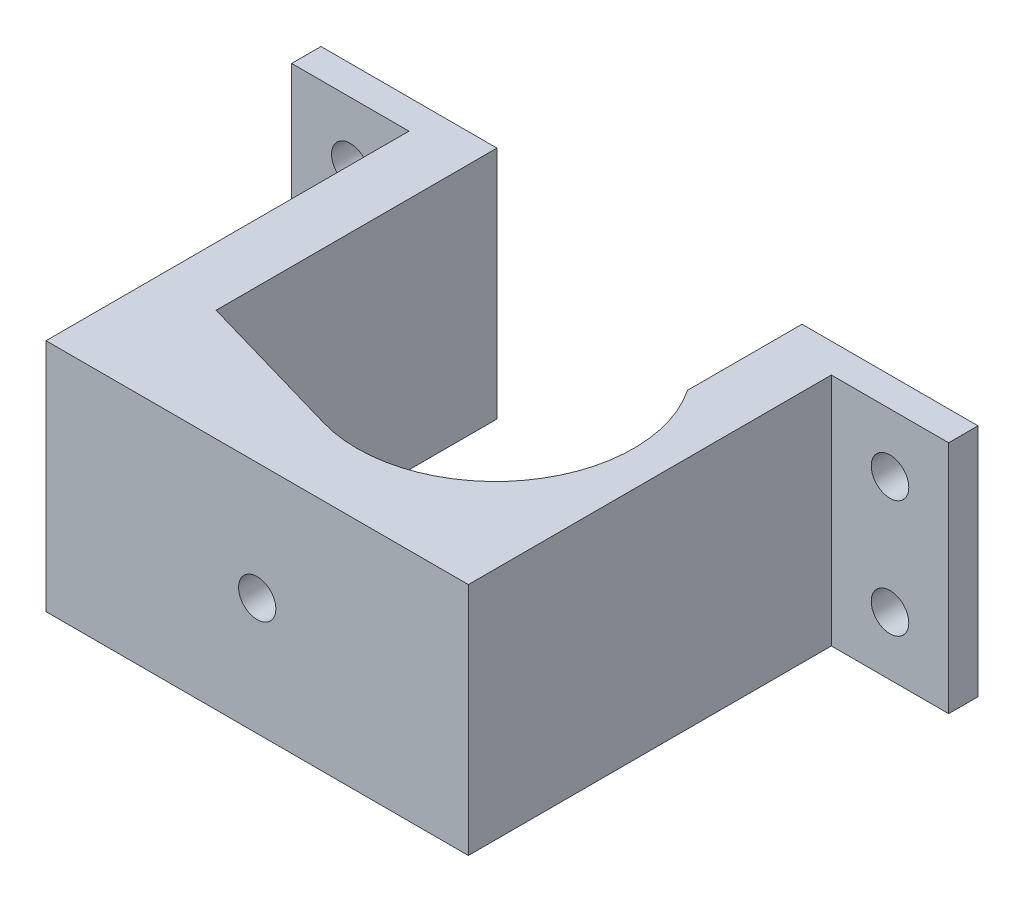
ISO-10303-21;
HEADER;
FILE_DESCRIPTION(('STEP AP214'),'2;1');
FILE_NAME('part.step','',(''),(''),'','','');
FILE_SCHEMA(('AUTOMOTIVE_DESIGN { 1 0 10303 214 1 1 1 1 }'));
ENDSEC;
DATA;
#1=APPLICATION_CONTEXT('core data for automotive mechanical design processes');
#2=APPLICATION_PROTOCOL_DEFINITION('international standard','automotive_design',2000,#1);
#3=PRODUCT_CONTEXT('',#1,'mechanical');
#4=PRODUCT('Part','Part','',(#3));
#5=PRODUCT_RELATED_PRODUCT_CATEGORY('part','',(#4));
#6=PRODUCT_DEFINITION_FORMATION('','',#4);
#7=PRODUCT_DEFINITION_CONTEXT('part definition',#1,'design');
#8=PRODUCT_DEFINITION('design','',#6,#7);
#9=PRODUCT_DEFINITION_SHAPE('','',#8);
#10=(LENGTH_UNIT() NAMED_UNIT(*) SI_UNIT(.MILLI.,.METRE.));
#11=(NAMED_UNIT(*) PLANE_ANGLE_UNIT() SI_UNIT($,.RADIAN.));
#12=(NAMED_UNIT(*) SI_UNIT($,.STERADIAN.) SOLID_ANGLE_UNIT());
#13=UNCERTAINTY_MEASURE_WITH_UNIT(LENGTH_MEASURE(1.E-05),#10,'distance_accuracy_value','');
#14=(GEOMETRIC_REPRESENTATION_CONTEXT(3) GLOBAL_UNCERTAINTY_ASSIGNED_CONTEXT((#13)) GLOBAL_UNIT_ASSIGNED_CONTEXT((#10,
#11,#12)) REPRESENTATION_CONTEXT('',''));
#15=CARTESIAN_POINT('',(0.,0.,0.));
#16=DIRECTION('',(0.,0.,1.));
#17=DIRECTION('',(1.,0.,0.));
#18=AXIS2_PLACEMENT_3D('',#15,#16,#17);
#19=CARTESIAN_POINT('',(18.796,25.4,21.7171296043708));
#20=DIRECTION('',(0.,0.,-1.));
#21=DIRECTION('',(-1.,0.,0.));
#22=AXIS2_PLACEMENT_3D('',#19,#20,#21);
#23=PLANE('',#22);
#24=DIRECTION('',(1.,0.,0.));
#25=VECTOR('',#24,1.);
#26=CARTESIAN_POINT('',(18.796,0.,21.7171296043708));
#27=LINE('',#26,#25);
#28=CARTESIAN_POINT('',(-26.924,0.,21.7171296043708));
#29=VERTEX_POINT('',#28);
#30=CARTESIAN_POINT('',(18.796,0.,21.7171296043708));
#31=VERTEX_POINT('',#30);
#32=EDGE_CURVE('E210',#29,#31,#27,.T.);
#33=ORIENTED_EDGE('',*,*,#32,.T.);
#34=DIRECTION('',(0.,-1.,0.));
#35=VECTOR('',#34,1.);
#36=CARTESIAN_POINT('',(18.796,25.4,21.7171296043708));
#37=LINE('',#36,#35);
#38=CARTESIAN_POINT('',(18.796,25.4,21.7171296043708));
#39=VERTEX_POINT('',#38);
#40=EDGE_CURVE('E254',#39,#31,#37,.T.);
#41=ORIENTED_EDGE('',*,*,#40,.F.);
#42=DIRECTION('',(1.,0.,0.));
#43=VECTOR('',#42,1.);
#44=CARTESIAN_POINT('',(18.796,25.4,21.7171296043708));
#45=LINE('',#44,#43);
#46=CARTESIAN_POINT('',(-26.924,25.4,21.7171296043708));
#47=VERTEX_POINT('',#46);
#48=EDGE_CURVE('E300',#47,#39,#45,.T.);
#49=ORIENTED_EDGE('',*,*,#48,.F.);
#50=DIRECTION('',(0.,-1.,0.));
#51=VECTOR('',#50,1.);
#52=CARTESIAN_POINT('',(-26.924,25.4,21.7171296043708));
#53=LINE('',#52,#51);
#54=EDGE_CURVE('E258',#47,#29,#53,.T.);
#55=ORIENTED_EDGE('',*,*,#54,.T.);
#56=EDGE_LOOP('',(#33,#41,#49,#55));
#57=FACE_BOUND('',#56,.T.);
#58=CARTESIAN_POINT('',(-4.06400000000001,12.7,21.7171296043708));
#59=DIRECTION('',(0.,0.,1.));
#60=DIRECTION('',(1.,0.,0.));
#61=AXIS2_PLACEMENT_3D('',#58,#59,#60);
#62=CIRCLE('',#61,2.01929999999999);
#63=CARTESIAN_POINT('',(-2.04470000000002,12.7,21.7171296043708));
#64=VERTEX_POINT('',#63);
#65=EDGE_CURVE('E331',#64,#64,#62,.T.);
#66=ORIENTED_EDGE('',*,*,#65,.F.);
#67=EDGE_LOOP('',(#66));
#68=FACE_BOUND('',#67,.T.);
#69=ADVANCED_FACE('F46',(#57,#68),#23,.F.);
#70=CARTESIAN_POINT('',(-20.574,25.4,-9.65199999999999));
#71=DIRECTION('',(-1.,0.,0.));
#72=DIRECTION('',(0.,0.,1.));
#73=AXIS2_PLACEMENT_3D('',#70,#71,#72);
#74=PLANE('',#73);
#75=DIRECTION('',(0.,0.,-1.));
#76=VECTOR('',#75,1.);
#77=CARTESIAN_POINT('',(-20.574,0.,-9.65199999999999));
#78=LINE('',#77,#76);
#79=CARTESIAN_POINT('',(-20.574,0.,9.65212960437079));
#80=VERTEX_POINT('',#79);
#81=CARTESIAN_POINT('',(-20.574,0.,-20.7467128871305));
#82=VERTEX_POINT('',#81);
#83=EDGE_CURVE('E123',#80,#82,#78,.T.);
#84=ORIENTED_EDGE('',*,*,#83,.T.);
#85=DIRECTION('',(0.,-1.,0.));
#86=VECTOR('',#85,1.);
#87=CARTESIAN_POINT('',(-20.574,25.4,-20.7467128871305));
#88=LINE('',#87,#86);
#89=CARTESIAN_POINT('',(-20.574,25.4,-20.7467128871305));
#90=VERTEX_POINT('',#89);
#91=EDGE_CURVE('E61',#90,#82,#88,.T.);
#92=ORIENTED_EDGE('',*,*,#91,.F.);
#93=DIRECTION('',(0.,0.,-1.));
#94=VECTOR('',#93,1.);
#95=CARTESIAN_POINT('',(-20.574,25.4,-9.65199999999999));
#96=LINE('',#95,#94);
#97=CARTESIAN_POINT('',(-20.574,25.4,9.65212960437079));
#98=VERTEX_POINT('',#97);
#99=EDGE_CURVE('E129',#98,#90,#96,.T.);
#100=ORIENTED_EDGE('',*,*,#99,.F.);
#101=DIRECTION('',(0.,-1.,0.));
#102=VECTOR('',#101,1.);
#103=CARTESIAN_POINT('',(-20.574,25.4,9.65212960437079));
#104=LINE('',#103,#102);
#105=EDGE_CURVE('E190',#98,#80,#104,.T.);
#106=ORIENTED_EDGE('',*,*,#105,.T.);
#107=EDGE_LOOP('',(#84,#92,#100,#106));
#108=FACE_BOUND('',#107,.T.);
#109=ADVANCED_FACE('F48',(#108),#74,.F.);
#110=CARTESIAN_POINT('',(-39.624,25.4,-20.7467128871305));
#111=DIRECTION('',(0.,0.,1.));
#112=DIRECTION('',(1.,0.,0.));
#113=AXIS2_PLACEMENT_3D('',#110,#111,#112);
#114=PLANE('',#113);
#115=CARTESIAN_POINT('',(-33.274,6.35,-20.7467128871305));
#116=DIRECTION('',(0.,0.,1.));
#117=DIRECTION('',(1.,0.,0.));
#118=AXIS2_PLACEMENT_3D('',#115,#116,#117);
#119=CIRCLE('',#118,2.032);
#120=CARTESIAN_POINT('',(-31.242,6.35,-20.7467128871305));
#121=VERTEX_POINT('',#120);
#122=EDGE_CURVE('E345',#121,#121,#119,.T.);
#123=ORIENTED_EDGE('',*,*,#122,.T.);
#124=EDGE_LOOP('',(#123));
#125=FACE_BOUND('',#124,.T.);
#126=CARTESIAN_POINT('',(-33.274,19.05,-20.7467128871305));
#127=DIRECTION('',(0.,0.,1.));
#128=DIRECTION('',(1.,0.,0.));
#129=AXIS2_PLACEMENT_3D('',#126,#127,#128);
#130=CIRCLE('',#129,2.03200000000002);
#131=CARTESIAN_POINT('',(-31.242,19.05,-20.7467128871305));
#132=VERTEX_POINT('',#131);
#133=EDGE_CURVE('E197',#132,#132,#130,.T.);
#134=ORIENTED_EDGE('',*,*,#133,.T.);
#135=EDGE_LOOP('',(#134));
#136=FACE_BOUND('',#135,.T.);
#137=DIRECTION('',(-1.,0.,0.));
#138=VECTOR('',#137,1.);
#139=CARTESIAN_POINT('',(-39.624,0.,-20.7467128871305));
#140=LINE('',#139,#138);
#141=CARTESIAN_POINT('',(-39.624,0.,-20.7467128871305));
#142=VERTEX_POINT('',#141);
#143=EDGE_CURVE('E196',#82,#142,#140,.T.);
#144=ORIENTED_EDGE('',*,*,#143,.T.);
#145=DIRECTION('',(0.,-1.,0.));
#146=VECTOR('',#145,1.);
#147=CARTESIAN_POINT('',(-39.624,25.4,-20.7467128871305));
#148=LINE('',#147,#146);
#149=CARTESIAN_POINT('',(-39.624,25.4,-20.7467128871305));
#150=VERTEX_POINT('',#149);
#151=EDGE_CURVE('E270',#150,#142,#148,.T.);
#152=ORIENTED_EDGE('',*,*,#151,.F.);
#153=DIRECTION('',(-1.,0.,0.));
#154=VECTOR('',#153,1.);
#155=CARTESIAN_POINT('',(-39.624,25.4,-20.7467128871305));
#156=LINE('',#155,#154);
#157=EDGE_CURVE('E279',#90,#150,#156,.T.);
#158=ORIENTED_EDGE('',*,*,#157,.F.);
#159=ORIENTED_EDGE('',*,*,#91,.T.);
#160=EDGE_LOOP('',(#144,#152,#158,#159));
#161=FACE_BOUND('',#160,.T.);
#162=ADVANCED_FACE('F277',(#125,#136,#161),#114,.F.);
#163=CARTESIAN_POINT('',(-39.624,25.4,-20.7467128871305));
#164=DIRECTION('',(1.,0.,0.));
#165=DIRECTION('',(0.,0.,-1.));
#166=AXIS2_PLACEMENT_3D('',#163,#164,#165);
#167=PLANE('',#166);
#168=DIRECTION('',(0.,0.,1.));
#169=VECTOR('',#168,1.);
#170=CARTESIAN_POINT('',(-39.624,0.,-20.7467128871305));
#171=LINE('',#170,#169);
#172=CARTESIAN_POINT('',(-39.624,0.,-17.5717128871305));
#173=VERTEX_POINT('',#172);
#174=EDGE_CURVE('E200',#142,#173,#171,.T.);
#175=ORIENTED_EDGE('',*,*,#174,.T.);
#176=DIRECTION('',(0.,-1.,0.));
#177=VECTOR('',#176,1.);
#178=CARTESIAN_POINT('',(-39.624,25.4,-17.5717128871305));
#179=LINE('',#178,#177);
#180=CARTESIAN_POINT('',(-39.624,25.4,-17.5717128871305));
#181=VERTEX_POINT('',#180);
#182=EDGE_CURVE('E266',#181,#173,#179,.T.);
#183=ORIENTED_EDGE('',*,*,#182,.F.);
#184=DIRECTION('',(0.,0.,1.));
#185=VECTOR('',#184,1.);
#186=CARTESIAN_POINT('',(-39.624,25.4,-20.7467128871305));
#187=LINE('',#186,#185);
#188=EDGE_CURVE('E296',#150,#181,#187,.T.);
#189=ORIENTED_EDGE('',*,*,#188,.F.);
#190=ORIENTED_EDGE('',*,*,#151,.T.);
#191=EDGE_LOOP('',(#175,#183,#189,#190));
#192=FACE_BOUND('',#191,.T.);
#193=ADVANCED_FACE('F286',(#192),#167,.F.);
#194=CARTESIAN_POINT('',(-39.624,25.4,-17.5717128871305));
#195=DIRECTION('',(0.,0.,-1.));
#196=DIRECTION('',(-1.,0.,0.));
#197=AXIS2_PLACEMENT_3D('',#194,#195,#196);
#198=PLANE('',#197);
#199=CARTESIAN_POINT('',(-33.274,6.35,-17.5717128871305));
#200=DIRECTION('',(0.,0.,1.));
#201=DIRECTION('',(1.,0.,0.));
#202=AXIS2_PLACEMENT_3D('',#199,#200,#201);
#203=CIRCLE('',#202,2.032);
#204=CARTESIAN_POINT('',(-31.242,6.35,-17.5717128871305));
#205=VERTEX_POINT('',#204);
#206=EDGE_CURVE('E350',#205,#205,#203,.T.);
#207=ORIENTED_EDGE('',*,*,#206,.F.);
#208=EDGE_LOOP('',(#207));
#209=FACE_BOUND('',#208,.T.);
#210=CARTESIAN_POINT('',(-33.274,19.05,-17.5717128871305));
#211=DIRECTION('',(0.,0.,1.));
#212=DIRECTION('',(1.,0.,0.));
#213=AXIS2_PLACEMENT_3D('',#210,#211,#212);
#214=CIRCLE('',#213,2.03200000000002);
#215=CARTESIAN_POINT('',(-31.242,19.05,-17.5717128871305));
#216=VERTEX_POINT('',#215);
#217=EDGE_CURVE('E349',#216,#216,#214,.T.);
#218=ORIENTED_EDGE('',*,*,#217,.F.);
#219=EDGE_LOOP('',(#218));
#220=FACE_BOUND('',#219,.T.);
#221=DIRECTION('',(1.,0.,0.));
#222=VECTOR('',#221,1.);
#223=CARTESIAN_POINT('',(-39.624,0.,-17.5717128871305));
#224=LINE('',#223,#222);
#225=CARTESIAN_POINT('',(-26.924,0.,-17.5717128871305));
#226=VERTEX_POINT('',#225);
#227=EDGE_CURVE('E203',#173,#226,#224,.T.);
#228=ORIENTED_EDGE('',*,*,#227,.T.);
#229=DIRECTION('',(0.,-1.,0.));
#230=VECTOR('',#229,1.);
#231=CARTESIAN_POINT('',(-26.924,25.4,-17.5717128871305));
#232=LINE('',#231,#230);
#233=CARTESIAN_POINT('',(-26.924,25.4,-17.5717128871305));
#234=VERTEX_POINT('',#233);
#235=EDGE_CURVE('E262',#234,#226,#232,.T.);
#236=ORIENTED_EDGE('',*,*,#235,.F.);
#237=DIRECTION('',(1.,0.,0.));
#238=VECTOR('',#237,1.);
#239=CARTESIAN_POINT('',(-39.624,25.4,-17.5717128871305));
#240=LINE('',#239,#238);
#241=EDGE_CURVE('E292',#181,#234,#240,.T.);
#242=ORIENTED_EDGE('',*,*,#241,.F.);
#243=ORIENTED_EDGE('',*,*,#182,.T.);
#244=EDGE_LOOP('',(#228,#236,#242,#243));
#245=FACE_BOUND('',#244,.T.);
#246=ADVANCED_FACE('F290',(#209,#220,#245),#198,.F.);
#247=CARTESIAN_POINT('',(-26.924,25.4,21.7171296043708));
#248=DIRECTION('',(1.,0.,0.));
#249=DIRECTION('',(0.,0.,-1.));
#250=AXIS2_PLACEMENT_3D('',#247,#248,#249);
#251=PLANE('',#250);
#252=DIRECTION('',(0.,0.,1.));
#253=VECTOR('',#252,1.);
#254=CARTESIAN_POINT('',(-26.924,0.,21.7171296043708));
#255=LINE('',#254,#253);
#256=EDGE_CURVE('E207',#226,#29,#255,.T.);
#257=ORIENTED_EDGE('',*,*,#256,.T.);
#258=ORIENTED_EDGE('',*,*,#54,.F.);
#259=DIRECTION('',(0.,0.,1.));
#260=VECTOR('',#259,1.);
#261=CARTESIAN_POINT('',(-26.924,25.4,-17.5717128871305));
#262=LINE('',#261,#260);
#263=EDGE_CURVE('E295',#234,#47,#262,.T.);
#264=ORIENTED_EDGE('',*,*,#263,.F.);
#265=ORIENTED_EDGE('',*,*,#235,.T.);
#266=EDGE_LOOP('',(#257,#258,#264,#265));
#267=FACE_BOUND('',#266,.T.);
#268=ADVANCED_FACE('F374',(#267),#251,.F.);
#269=CARTESIAN_POINT('',(18.796,25.4,-17.5717128871305));
#270=DIRECTION('',(-1.,0.,0.));
#271=DIRECTION('',(0.,0.,1.));
#272=AXIS2_PLACEMENT_3D('',#269,#270,#271);
#273=PLANE('',#272);
#274=DIRECTION('',(0.,0.,-1.));
#275=VECTOR('',#274,1.);
#276=CARTESIAN_POINT('',(18.796,0.,-17.5717128871305));
#277=LINE('',#276,#275);
#278=CARTESIAN_POINT('',(18.796,0.,-17.5717128871305));
#279=VERTEX_POINT('',#278);
#280=EDGE_CURVE('E214',#31,#279,#277,.T.);
#281=ORIENTED_EDGE('',*,*,#280,.T.);
#282=DIRECTION('',(0.,-1.,0.));
#283=VECTOR('',#282,1.);
#284=CARTESIAN_POINT('',(18.796,25.4,-17.5717128871305));
#285=LINE('',#284,#283);
#286=CARTESIAN_POINT('',(18.796,25.4,-17.5717128871305));
#287=VERTEX_POINT('',#286);
#288=EDGE_CURVE('E250',#287,#279,#285,.T.);
#289=ORIENTED_EDGE('',*,*,#288,.F.);
#290=DIRECTION('',(0.,0.,-1.));
#291=VECTOR('',#290,1.);
#292=CARTESIAN_POINT('',(18.796,25.4,12.8271296043708));
#293=LINE('',#292,#291);
#294=EDGE_CURVE('E307',#39,#287,#293,.T.);
#295=ORIENTED_EDGE('',*,*,#294,.F.);
#296=ORIENTED_EDGE('',*,*,#40,.T.);
#297=EDGE_LOOP('',(#281,#289,#295,#296));
#298=FACE_BOUND('',#297,.T.);
#299=ADVANCED_FACE('F381',(#298),#273,.F.);
#300=CARTESIAN_POINT('',(31.496,25.4,-17.5717128871305));
#301=DIRECTION('',(0.,0.,-1.));
#302=DIRECTION('',(-1.,0.,0.));
#303=AXIS2_PLACEMENT_3D('',#300,#301,#302);
#304=PLANE('',#303);
#305=CARTESIAN_POINT('',(25.146,19.05,-17.5717128871305));
#306=DIRECTION('',(0.,0.,1.));
#307=DIRECTION('',(1.,0.,0.));
#308=AXIS2_PLACEMENT_3D('',#305,#306,#307);
#309=CIRCLE('',#308,2.03200000000002);
#310=CARTESIAN_POINT('',(27.178,19.05,-17.5717128871305));
#311=VERTEX_POINT('',#310);
#312=EDGE_CURVE('E343',#311,#311,#309,.T.);
#313=ORIENTED_EDGE('',*,*,#312,.F.);
#314=EDGE_LOOP('',(#313));
#315=FACE_BOUND('',#314,.T.);
#316=CARTESIAN_POINT('',(25.146,6.35000000000002,-17.5717128871305));
#317=DIRECTION('',(0.,0.,1.));
#318=DIRECTION('',(1.,0.,0.));
#319=AXIS2_PLACEMENT_3D('',#316,#317,#318);
#320=CIRCLE('',#319,2.032);
#321=CARTESIAN_POINT('',(27.178,6.35000000000002,-17.5717128871305));
#322=VERTEX_POINT('',#321);
#323=EDGE_CURVE('E330',#322,#322,#320,.T.);
#324=ORIENTED_EDGE('',*,*,#323,.F.);
#325=EDGE_LOOP('',(#324));
#326=FACE_BOUND('',#325,.T.);
#327=DIRECTION('',(1.,0.,0.));
#328=VECTOR('',#327,1.);
#329=CARTESIAN_POINT('',(31.496,0.,-17.5717128871305));
#330=LINE('',#329,#328);
#331=CARTESIAN_POINT('',(31.496,0.,-17.5717128871305));
#332=VERTEX_POINT('',#331);
#333=EDGE_CURVE('E217',#279,#332,#330,.T.);
#334=ORIENTED_EDGE('',*,*,#333,.T.);
#335=DIRECTION('',(0.,-1.,0.));
#336=VECTOR('',#335,1.);
#337=CARTESIAN_POINT('',(31.496,25.4,-17.5717128871305));
#338=LINE('',#337,#336);
#339=CARTESIAN_POINT('',(31.496,25.4,-17.5717128871305));
#340=VERTEX_POINT('',#339);
#341=EDGE_CURVE('E246',#340,#332,#338,.T.);
#342=ORIENTED_EDGE('',*,*,#341,.F.);
#343=DIRECTION('',(1.,0.,0.));
#344=VECTOR('',#343,1.);
#345=CARTESIAN_POINT('',(31.496,25.4,-17.5717128871305));
#346=LINE('',#345,#344);
#347=EDGE_CURVE('E310',#287,#340,#346,.T.);
#348=ORIENTED_EDGE('',*,*,#347,.F.);
#349=ORIENTED_EDGE('',*,*,#288,.T.);
#350=EDGE_LOOP('',(#334,#342,#348,#349));
#351=FACE_BOUND('',#350,.T.);
#352=ADVANCED_FACE('F396',(#315,#326,#351),#304,.F.);
#353=CARTESIAN_POINT('',(31.496,25.4,-20.7467128871305));
#354=DIRECTION('',(-1.,0.,0.));
#355=DIRECTION('',(0.,0.,1.));
#356=AXIS2_PLACEMENT_3D('',#353,#354,#355);
#357=PLANE('',#356);
#358=DIRECTION('',(0.,0.,-1.));
#359=VECTOR('',#358,1.);
#360=CARTESIAN_POINT('',(31.496,0.,-20.7467128871305));
#361=LINE('',#360,#359);
#362=CARTESIAN_POINT('',(31.496,0.,-20.7467128871305));
#363=VERTEX_POINT('',#362);
#364=EDGE_CURVE('E220',#332,#363,#361,.T.);
#365=ORIENTED_EDGE('',*,*,#364,.T.);
#366=DIRECTION('',(0.,-1.,0.));
#367=VECTOR('',#366,1.);
#368=CARTESIAN_POINT('',(31.496,25.4,-20.7467128871305));
#369=LINE('',#368,#367);
#370=CARTESIAN_POINT('',(31.496,25.4,-20.7467128871305));
#371=VERTEX_POINT('',#370);
#372=EDGE_CURVE('E242',#371,#363,#369,.T.);
#373=ORIENTED_EDGE('',*,*,#372,.F.);
#374=DIRECTION('',(0.,0.,-1.));
#375=VECTOR('',#374,1.);
#376=CARTESIAN_POINT('',(31.496,25.4,-20.7467128871305));
#377=LINE('',#376,#375);
#378=EDGE_CURVE('E313',#340,#371,#377,.T.);
#379=ORIENTED_EDGE('',*,*,#378,.F.);
#380=ORIENTED_EDGE('',*,*,#341,.T.);
#381=EDGE_LOOP('',(#365,#373,#379,#380));
#382=FACE_BOUND('',#381,.T.);
#383=ADVANCED_FACE('F321',(#382),#357,.F.);
#384=CARTESIAN_POINT('',(12.446,25.4,-20.7467128871305));
#385=DIRECTION('',(0.,0.,1.));
#386=DIRECTION('',(1.,0.,0.));
#387=AXIS2_PLACEMENT_3D('',#384,#385,#386);
#388=PLANE('',#387);
#389=CARTESIAN_POINT('',(25.146,19.05,-20.7467128871305));
#390=DIRECTION('',(0.,0.,1.));
#391=DIRECTION('',(1.,0.,0.));
#392=AXIS2_PLACEMENT_3D('',#389,#390,#391);
#393=CIRCLE('',#392,2.03200000000002);
#394=CARTESIAN_POINT('',(27.178,19.05,-20.7467128871305));
#395=VERTEX_POINT('',#394);
#396=EDGE_CURVE('E354',#395,#395,#393,.T.);
#397=ORIENTED_EDGE('',*,*,#396,.T.);
#398=EDGE_LOOP('',(#397));
#399=FACE_BOUND('',#398,.T.);
#400=CARTESIAN_POINT('',(25.146,6.35000000000002,-20.7467128871305));
#401=DIRECTION('',(0.,0.,1.));
#402=DIRECTION('',(1.,0.,0.));
#403=AXIS2_PLACEMENT_3D('',#400,#401,#402);
#404=CIRCLE('',#403,2.032);
#405=CARTESIAN_POINT('',(27.178,6.35000000000002,-20.7467128871305));
#406=VERTEX_POINT('',#405);
#407=EDGE_CURVE('E336',#406,#406,#404,.T.);
#408=ORIENTED_EDGE('',*,*,#407,.T.);
#409=EDGE_LOOP('',(#408));
#410=FACE_BOUND('',#409,.T.);
#411=DIRECTION('',(-1.,0.,0.));
#412=VECTOR('',#411,1.);
#413=CARTESIAN_POINT('',(12.446,0.,-20.7467128871305));
#414=LINE('',#413,#412);
#415=CARTESIAN_POINT('',(12.446,0.,-20.7467128871305));
#416=VERTEX_POINT('',#415);
#417=EDGE_CURVE('E223',#363,#416,#414,.T.);
#418=ORIENTED_EDGE('',*,*,#417,.T.);
#419=DIRECTION('',(0.,-1.,0.));
#420=VECTOR('',#419,1.);
#421=CARTESIAN_POINT('',(12.446,25.4,-20.7467128871305));
#422=LINE('',#421,#420);
#423=CARTESIAN_POINT('',(12.446,25.4,-20.7467128871305));
#424=VERTEX_POINT('',#423);
#425=EDGE_CURVE('E181',#424,#416,#422,.T.);
#426=ORIENTED_EDGE('',*,*,#425,.F.);
#427=DIRECTION('',(-1.,0.,0.));
#428=VECTOR('',#427,1.);
#429=CARTESIAN_POINT('',(12.446,25.4,-20.7467128871305));
#430=LINE('',#429,#428);
#431=EDGE_CURVE('E166',#371,#424,#430,.T.);
#432=ORIENTED_EDGE('',*,*,#431,.F.);
#433=ORIENTED_EDGE('',*,*,#372,.T.);
#434=EDGE_LOOP('',(#418,#426,#432,#433));
#435=FACE_BOUND('',#434,.T.);
#436=ADVANCED_FACE('F325',(#399,#410,#435),#388,.F.);
#437=CARTESIAN_POINT('',(12.446,25.4,-20.7467128871305));
#438=DIRECTION('',(1.,0.,0.));
#439=DIRECTION('',(0.,0.,-1.));
#440=AXIS2_PLACEMENT_3D('',#437,#438,#439);
#441=PLANE('',#440);
#442=DIRECTION('',(0.,0.,1.));
#443=VECTOR('',#442,1.);
#444=CARTESIAN_POINT('',(12.446,0.,-20.7467128871305));
#445=LINE('',#444,#443);
#446=CARTESIAN_POINT('',(12.446,0.,-8.34779649654001));
#447=VERTEX_POINT('',#446);
#448=EDGE_CURVE('E176',#416,#447,#445,.T.);
#449=ORIENTED_EDGE('',*,*,#448,.T.);
#450=DIRECTION('',(0.,-1.,0.));
#451=VECTOR('',#450,1.);
#452=CARTESIAN_POINT('',(12.446,25.4,-8.34779649654001));
#453=LINE('',#452,#451);
#454=CARTESIAN_POINT('',(12.446,25.4,-8.34779649654001));
#455=VERTEX_POINT('',#454);
#456=EDGE_CURVE('E173',#455,#447,#453,.T.);
#457=ORIENTED_EDGE('',*,*,#456,.F.);
#458=DIRECTION('',(0.,0.,1.));
#459=VECTOR('',#458,1.);
#460=CARTESIAN_POINT('',(12.446,25.4,-20.7467128871305));
#461=LINE('',#460,#459);
#462=EDGE_CURVE('E159',#424,#455,#461,.T.);
#463=ORIENTED_EDGE('',*,*,#462,.F.);
#464=ORIENTED_EDGE('',*,*,#425,.T.);
#465=EDGE_LOOP('',(#449,#457,#463,#464));
#466=FACE_BOUND('',#465,.T.);
#467=ADVANCED_FACE('F174',(#466),#441,.F.);
#468=CARTESIAN_POINT('',(0.,25.4,0.));
#469=DIRECTION('',(0.,-1.,0.));
#470=DIRECTION('',(0.,0.,-1.));
#471=AXIS2_PLACEMENT_3D('',#468,#469,#470);
#472=CYLINDRICAL_SURFACE('',#471,14.9862811380157);
#473=DIRECTION('',(0.,-1.,0.));
#474=VECTOR('',#473,1.);
#475=CARTESIAN_POINT('',(-4.16201958345776,25.4,14.3967432197202));
#476=LINE('',#475,#474);
#477=CARTESIAN_POINT('',(-4.16201958345776,10.683080405356,14.3967432197202));
#478=VERTEX_POINT('',#477);
#479=CARTESIAN_POINT('',(-4.16201958345776,0.,14.3967432197202));
#480=VERTEX_POINT('',#479);
#481=EDGE_CURVE('E237',#478,#480,#476,.T.);
#482=ORIENTED_EDGE('',*,*,#481,.F.);
#483=CARTESIAN_POINT('',(-4.16201958345776,10.683080405356,14.3967432197202));
#484=CARTESIAN_POINT('',(-4.10518655365808,10.6803198385047,14.4131751859458));
#485=CARTESIAN_POINT('',(-4.04817126170855,10.6799570663627,14.4292909831113));
#486=CARTESIAN_POINT('',(-3.93410885030647,10.6840727063026,14.4608058253478));
#487=CARTESIAN_POINT('',(-3.87706172734988,10.6885518487796,14.4762047619159));
#488=CARTESIAN_POINT('',(-3.70643166926872,10.7093166008282,14.5211833508265));
#489=CARTESIAN_POINT('',(-3.59332569012866,10.7329278324233,14.5495547010112));
#490=CARTESIAN_POINT('',(-3.37186857975921,10.7994924510234,14.6024702423059));
#491=CARTESIAN_POINT('',(-3.26352457258627,10.8424738031192,14.627008830752));
#492=CARTESIAN_POINT('',(-3.05523146794569,10.9468577984105,14.6719299141102));
#493=CARTESIAN_POINT('',(-2.95527622220349,11.0082467967061,14.6923154687782));
#494=CARTESIAN_POINT('',(-2.76950822820195,11.1460091952429,14.7284482438292));
#495=CARTESIAN_POINT('',(-2.68339305233481,11.2219468262098,14.7443031986223));
#496=CARTESIAN_POINT('',(-2.52497732752564,11.3877032243555,14.7722577017791));
#497=CARTESIAN_POINT('',(-2.45267913407624,11.4775243536538,14.7843566100385));
#498=CARTESIAN_POINT('',(-2.32552170969287,11.6665633129612,14.8048861488369));
#499=CARTESIAN_POINT('',(-2.27035026245078,11.765564063393,14.8133836332054));
#500=CARTESIAN_POINT('',(-2.17727742053291,11.9715620482139,14.8273501195585));
#501=CARTESIAN_POINT('',(-2.13937377625522,12.0785582388637,14.8328195160541));
#502=CARTESIAN_POINT('',(-2.08215862141396,12.2968436698864,14.840959372896));
#503=CARTESIAN_POINT('',(-2.06274027240303,12.4081043260854,14.8436459251482));
#504=CARTESIAN_POINT('',(-2.04269704897467,12.6323411487824,14.8464176283274));
#505=CARTESIAN_POINT('',(-2.0420726000983,12.7453173540668,14.8465027203507));
#506=CARTESIAN_POINT('',(-2.0596302571484,12.9696767514607,14.8440769820687));
#507=CARTESIAN_POINT('',(-2.0777969383829,13.0810611741556,14.8415682808781));
#508=CARTESIAN_POINT('',(-2.13236671063841,13.2991675170066,14.8338257595794));
#509=CARTESIAN_POINT('',(-2.16876932554813,13.4058895588111,14.8285920106177));
#510=CARTESIAN_POINT('',(-2.25871349973572,13.611658771125,14.8151575029018));
#511=CARTESIAN_POINT('',(-2.31225662483818,13.7107052394263,14.8069564730709));
#512=CARTESIAN_POINT('',(-2.434845044784,13.8983254166867,14.787291534779));
#513=CARTESIAN_POINT('',(-2.50389045652486,13.986899046666,14.7758276017134));
#514=CARTESIAN_POINT('',(-2.65550346034768,14.151287931921,14.7493335962098));
#515=CARTESIAN_POINT('',(-2.73809656253263,14.2270785601513,14.7342967716356));
#516=CARTESIAN_POINT('',(-2.91416851546191,14.363693533866,14.7004851857967));
#517=CARTESIAN_POINT('',(-3.00764746386741,14.4245177450655,14.6817103909961));
#518=CARTESIAN_POINT('',(-3.20360875595405,14.5302515182801,14.6402060942297));
#519=CARTESIAN_POINT('',(-3.30617026138259,14.5749994989051,14.6174396861787));
#520=CARTESIAN_POINT('',(-3.51647818294622,14.6468256254687,14.5682752720064));
#521=CARTESIAN_POINT('',(-3.62422378183949,14.673906546779,14.5418778370834));
#522=CARTESIAN_POINT('',(-3.80418967711711,14.7038196355898,14.4955919143991));
#523=CARTESIAN_POINT('',(-3.87583304765222,14.7117955661445,14.4766024282395));
#524=CARTESIAN_POINT('',(-4.01909351398374,14.7200733238102,14.4374879742501));
#525=CARTESIAN_POINT('',(-4.0907103528281,14.7203911247446,14.4173654577215));
#526=CARTESIAN_POINT('',(-4.16201958345776,14.7169195946439,14.3967432197202));
#527=B_SPLINE_CURVE_WITH_KNOTS('',3,(#483,#484,#485,#486,#487,#488,#489,#490,#491,#492,#493,
#494,#495,#496,#497,#498,#499,#500,#501,#502,#503,#504,#505,#506,#507,#508,#509,#510,#511,#512,
#513,#514,#515,#516,#517,#518,#519,#520,#521,#522,#523,#524,#525,#526),.UNSPECIFIED.,.F.,.F.,(4,
2,2,2,2,2,2,2,2,2,2,2,2,2,2,2,2,2,2,2,2,4),(0.,0.177574644653031,0.355176079894113,
0.710272882927685,1.06588399796535,1.42123216069955,1.76724993867882,2.11332665258681,
2.45266320403928,2.79195553500761,3.12927475261364,3.46660160796743,3.80365178826834,
4.14069316918264,4.47776534838401,4.81484006941807,5.15255694110698,5.4902768428193,
5.83130198253635,6.17227353667488,6.39553322515516,6.61832718370005),.UNSPECIFIED.);
#528=CARTESIAN_POINT('',(-4.16201958345776,14.7169195946439,14.3967432197202));
#529=VERTEX_POINT('',#528);
#530=EDGE_CURVE('E11',#478,#529,#527,.T.);
#531=ORIENTED_EDGE('',*,*,#530,.T.);
#532=CARTESIAN_POINT('',(-4.16201958345776,25.4,14.3967432197202));
#533=VERTEX_POINT('',#532);
#534=EDGE_CURVE('E182',#533,#529,#476,.T.);
#535=ORIENTED_EDGE('',*,*,#534,.F.);
#536=CARTESIAN_POINT('',(0.,25.4,0.));
#537=DIRECTION('',(0.,-1.,0.));
#538=DIRECTION('',(0.,0.,1.));
#539=AXIS2_PLACEMENT_3D('',#536,#537,#538);
#540=CIRCLE('',#539,14.9862811380157);
#541=EDGE_CURVE('E163',#455,#533,#540,.T.);
#542=ORIENTED_EDGE('',*,*,#541,.F.);
#543=ORIENTED_EDGE('',*,*,#456,.T.);
#544=CARTESIAN_POINT('',(0.,0.,0.));
#545=DIRECTION('',(0.,-1.,0.));
#546=DIRECTION('',(0.,0.,1.));
#547=AXIS2_PLACEMENT_3D('',#544,#545,#546);
#548=CIRCLE('',#547,14.9862811380157);
#549=EDGE_CURVE('E228',#447,#480,#548,.T.);
#550=ORIENTED_EDGE('',*,*,#549,.T.);
#551=EDGE_LOOP('',(#482,#531,#535,#542,#543,#550));
#552=FACE_BOUND('',#551,.T.);
#553=ADVANCED_FACE('F185',(#552),#472,.F.);
#554=CARTESIAN_POINT('',(-20.574,25.4,9.65212960437079));
#555=DIRECTION('',(-0.27772197419278,0.,0.960661493477523));
#556=DIRECTION('',(0.960661493477523,0.,0.27772197419278));
#557=AXIS2_PLACEMENT_3D('',#554,#555,#556);
#558=PLANE('',#557);
#559=ORIENTED_EDGE('',*,*,#534,.T.);
#560=CARTESIAN_POINT('',(-4.06400000000001,12.7,14.4250801442376));
#561=DIRECTION('',(-0.27772197419278,0.,0.960661493477523));
#562=DIRECTION('',(0.960661493477523,0.,0.27772197419278));
#563=AXIS2_PLACEMENT_3D('',#560,#561,#562);
#564=ELLIPSE('',#563,2.10198911240866,2.01929999999999);
#565=EDGE_CURVE('E67',#529,#478,#564,.T.);
#566=ORIENTED_EDGE('',*,*,#565,.T.);
#567=ORIENTED_EDGE('',*,*,#481,.T.);
#568=DIRECTION('',(-0.960661493477523,0.,-0.27772197419278));
#569=VECTOR('',#568,1.);
#570=CARTESIAN_POINT('',(-20.574,0.,9.65212960437079));
#571=LINE('',#570,#569);
#572=EDGE_CURVE('E231',#480,#80,#571,.T.);
#573=ORIENTED_EDGE('',*,*,#572,.T.);
#574=ORIENTED_EDGE('',*,*,#105,.F.);
#575=DIRECTION('',(-0.960661493477523,0.,-0.27772197419278));
#576=VECTOR('',#575,1.);
#577=CARTESIAN_POINT('',(-20.574,25.4,9.65212960437079));
#578=LINE('',#577,#576);
#579=EDGE_CURVE('E75',#533,#98,#578,.T.);
#580=ORIENTED_EDGE('',*,*,#579,.F.);
#581=EDGE_LOOP('',(#559,#566,#567,#573,#574,#580));
#582=FACE_BOUND('',#581,.T.);
#583=ADVANCED_FACE('F328',(#582),#558,.F.);
#584=CARTESIAN_POINT('',(0.,25.4,0.));
#585=DIRECTION('',(0.,1.,0.));
#586=DIRECTION('',(0.,0.,1.));
#587=AXIS2_PLACEMENT_3D('',#584,#585,#586);
#588=PLANE('',#587);
#589=ORIENTED_EDGE('',*,*,#99,.T.);
#590=ORIENTED_EDGE('',*,*,#157,.T.);
#591=ORIENTED_EDGE('',*,*,#188,.T.);
#592=ORIENTED_EDGE('',*,*,#241,.T.);
#593=ORIENTED_EDGE('',*,*,#263,.T.);
#594=ORIENTED_EDGE('',*,*,#48,.T.);
#595=ORIENTED_EDGE('',*,*,#294,.T.);
#596=ORIENTED_EDGE('',*,*,#347,.T.);
#597=ORIENTED_EDGE('',*,*,#378,.T.);
#598=ORIENTED_EDGE('',*,*,#431,.T.);
#599=ORIENTED_EDGE('',*,*,#462,.T.);
#600=ORIENTED_EDGE('',*,*,#541,.T.);
#601=ORIENTED_EDGE('',*,*,#579,.T.);
#602=EDGE_LOOP('',(#589,#590,#591,#592,#593,#594,#595,#596,#597,#598,#599,#600,#601));
#603=FACE_BOUND('',#602,.T.);
#604=ADVANCED_FACE('F161',(#603),#588,.T.);
#605=CARTESIAN_POINT('',(0.,0.,0.));
#606=DIRECTION('',(0.,1.,0.));
#607=DIRECTION('',(0.,0.,1.));
#608=AXIS2_PLACEMENT_3D('',#605,#606,#607);
#609=PLANE('',#608);
#610=ORIENTED_EDGE('',*,*,#83,.F.);
#611=ORIENTED_EDGE('',*,*,#572,.F.);
#612=ORIENTED_EDGE('',*,*,#549,.F.);
#613=ORIENTED_EDGE('',*,*,#448,.F.);
#614=ORIENTED_EDGE('',*,*,#417,.F.);
#615=ORIENTED_EDGE('',*,*,#364,.F.);
#616=ORIENTED_EDGE('',*,*,#333,.F.);
#617=ORIENTED_EDGE('',*,*,#280,.F.);
#618=ORIENTED_EDGE('',*,*,#32,.F.);
#619=ORIENTED_EDGE('',*,*,#256,.F.);
#620=ORIENTED_EDGE('',*,*,#227,.F.);
#621=ORIENTED_EDGE('',*,*,#174,.F.);
#622=ORIENTED_EDGE('',*,*,#143,.F.);
#623=EDGE_LOOP('',(#610,#611,#612,#613,#614,#615,#616,#617,#618,#619,#620,#621,#622));
#624=FACE_BOUND('',#623,.T.);
#625=ADVANCED_FACE('F282',(#624),#609,.F.);
#626=CARTESIAN_POINT('',(25.146,6.35000000000002,-20.7467128871305));
#627=DIRECTION('',(0.,0.,1.));
#628=DIRECTION('',(1.,0.,0.));
#629=AXIS2_PLACEMENT_3D('',#626,#627,#628);
#630=CYLINDRICAL_SURFACE('',#629,2.032);
#631=ORIENTED_EDGE('',*,*,#407,.F.);
#632=EDGE_LOOP('',(#631));
#633=FACE_BOUND('',#632,.T.);
#634=ORIENTED_EDGE('',*,*,#323,.T.);
#635=EDGE_LOOP('',(#634));
#636=FACE_BOUND('',#635,.T.);
#637=ADVANCED_FACE('F414',(#633,#636),#630,.F.);
#638=CARTESIAN_POINT('',(25.146,19.05,-20.7467128871305));
#639=DIRECTION('',(0.,0.,1.));
#640=DIRECTION('',(1.,0.,0.));
#641=AXIS2_PLACEMENT_3D('',#638,#639,#640);
#642=CYLINDRICAL_SURFACE('',#641,2.03200000000002);
#643=ORIENTED_EDGE('',*,*,#396,.F.);
#644=EDGE_LOOP('',(#643));
#645=FACE_BOUND('',#644,.T.);
#646=ORIENTED_EDGE('',*,*,#312,.T.);
#647=EDGE_LOOP('',(#646));
#648=FACE_BOUND('',#647,.T.);
#649=ADVANCED_FACE('F420',(#645,#648),#642,.F.);
#650=CARTESIAN_POINT('',(-33.274,19.05,-20.7467128871305));
#651=DIRECTION('',(0.,0.,1.));
#652=DIRECTION('',(1.,0.,0.));
#653=AXIS2_PLACEMENT_3D('',#650,#651,#652);
#654=CYLINDRICAL_SURFACE('',#653,2.03200000000002);
#655=ORIENTED_EDGE('',*,*,#133,.F.);
#656=EDGE_LOOP('',(#655));
#657=FACE_BOUND('',#656,.T.);
#658=ORIENTED_EDGE('',*,*,#217,.T.);
#659=EDGE_LOOP('',(#658));
#660=FACE_BOUND('',#659,.T.);
#661=ADVANCED_FACE('F371',(#657,#660),#654,.F.);
#662=CARTESIAN_POINT('',(-33.274,6.35,-20.7467128871305));
#663=DIRECTION('',(0.,0.,1.));
#664=DIRECTION('',(1.,0.,0.));
#665=AXIS2_PLACEMENT_3D('',#662,#663,#664);
#666=CYLINDRICAL_SURFACE('',#665,2.032);
#667=ORIENTED_EDGE('',*,*,#122,.F.);
#668=EDGE_LOOP('',(#667));
#669=FACE_BOUND('',#668,.T.);
#670=ORIENTED_EDGE('',*,*,#206,.T.);
#671=EDGE_LOOP('',(#670));
#672=FACE_BOUND('',#671,.T.);
#673=ADVANCED_FACE('F419',(#669,#672),#666,.F.);
#674=CARTESIAN_POINT('',(-4.06400000000001,12.7,21.7171296043708));
#675=DIRECTION('',(0.,0.,1.));
#676=DIRECTION('',(1.,0.,0.));
#677=AXIS2_PLACEMENT_3D('',#674,#675,#676);
#678=CYLINDRICAL_SURFACE('',#677,2.01929999999999);
#679=ORIENTED_EDGE('',*,*,#65,.T.);
#680=EDGE_LOOP('',(#679));
#681=FACE_BOUND('',#680,.T.);
#682=ORIENTED_EDGE('',*,*,#530,.F.);
#683=ORIENTED_EDGE('',*,*,#565,.F.);
#684=EDGE_LOOP('',(#682,#683));
#685=FACE_BOUND('',#684,.T.);
#686=ADVANCED_FACE('F427',(#681,#685),#678,.F.);
#687=CLOSED_SHELL('',(#69,#109,#162,#193,#246,#268,#299,#352,#383,#436,#467,#553,#583,#604,#625,
#637,#649,#661,#673,#686));
#688=MANIFOLD_SOLID_BREP('B2',#687);
#689=ADVANCED_BREP_SHAPE_REPRESENTATION('',(#18,#688),#14);
#690=SHAPE_DEFINITION_REPRESENTATION(#9,#689);
ENDSEC;
END-ISO-10303-21;
